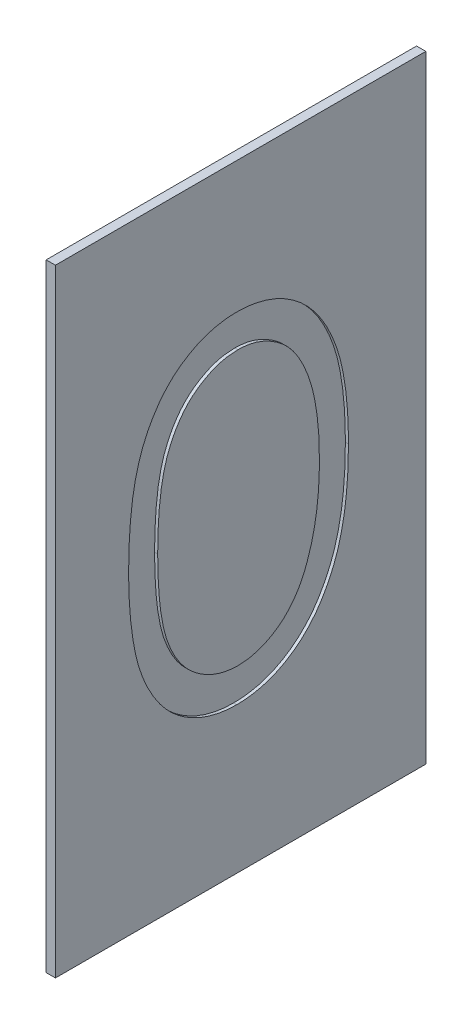
ISO-10303-21;
HEADER;
FILE_DESCRIPTION(('STEP AP214'),'2;1');
FILE_NAME('part.step','',(''),(''),'','','');
FILE_SCHEMA(('AUTOMOTIVE_DESIGN { 1 0 10303 214 1 1 1 1 }'));
ENDSEC;
DATA;
#1=APPLICATION_CONTEXT('core data for automotive mechanical design processes');
#2=APPLICATION_PROTOCOL_DEFINITION('international standard','automotive_design',2000,#1);
#3=PRODUCT_CONTEXT('',#1,'mechanical');
#4=PRODUCT('Part','Part','',(#3));
#5=PRODUCT_RELATED_PRODUCT_CATEGORY('part','',(#4));
#6=PRODUCT_DEFINITION_FORMATION('','',#4);
#7=PRODUCT_DEFINITION_CONTEXT('part definition',#1,'design');
#8=PRODUCT_DEFINITION('design','',#6,#7);
#9=PRODUCT_DEFINITION_SHAPE('','',#8);
#10=(LENGTH_UNIT() NAMED_UNIT(*) SI_UNIT(.MILLI.,.METRE.));
#11=(NAMED_UNIT(*) PLANE_ANGLE_UNIT() SI_UNIT($,.RADIAN.));
#12=(NAMED_UNIT(*) SI_UNIT($,.STERADIAN.) SOLID_ANGLE_UNIT());
#13=UNCERTAINTY_MEASURE_WITH_UNIT(LENGTH_MEASURE(1.E-05),#10,'distance_accuracy_value','');
#14=(GEOMETRIC_REPRESENTATION_CONTEXT(3) GLOBAL_UNCERTAINTY_ASSIGNED_CONTEXT((#13)) GLOBAL_UNIT_ASSIGNED_CONTEXT((#10,
#11,#12)) REPRESENTATION_CONTEXT('',''));
#15=CARTESIAN_POINT('',(0.,0.,0.));
#16=DIRECTION('',(0.,0.,1.));
#17=DIRECTION('',(1.,0.,0.));
#18=AXIS2_PLACEMENT_3D('',#15,#16,#17);
#19=CARTESIAN_POINT('',(1.5,0.,0.));
#20=DIRECTION('',(-1.,0.,0.));
#21=DIRECTION('',(0.,0.,1.));
#22=AXIS2_PLACEMENT_3D('',#19,#20,#21);
#23=PLANE('',#22);
#24=DIRECTION('',(0.,-1.,0.));
#25=VECTOR('',#24,1.);
#26=CARTESIAN_POINT('',(1.5,0.,0.));
#27=LINE('',#26,#25);
#28=CARTESIAN_POINT('',(1.5,100.,0.));
#29=VERTEX_POINT('',#28);
#30=CARTESIAN_POINT('',(1.5,0.,0.));
#31=VERTEX_POINT('',#30);
#32=EDGE_CURVE('E241',#29,#31,#27,.T.);
#33=ORIENTED_EDGE('',*,*,#32,.T.);
#34=DIRECTION('',(0.,0.,-1.));
#35=VECTOR('',#34,1.);
#36=CARTESIAN_POINT('',(1.5,0.,0.));
#37=LINE('',#36,#35);
#38=CARTESIAN_POINT('',(1.5,0.,-60.));
#39=VERTEX_POINT('',#38);
#40=EDGE_CURVE('E244',#31,#39,#37,.T.);
#41=ORIENTED_EDGE('',*,*,#40,.T.);
#42=DIRECTION('',(0.,1.,0.));
#43=VECTOR('',#42,1.);
#44=CARTESIAN_POINT('',(1.5,0.,-60.));
#45=LINE('',#44,#43);
#46=CARTESIAN_POINT('',(1.5,100.,-60.));
#47=VERTEX_POINT('',#46);
#48=EDGE_CURVE('E247',#39,#47,#45,.T.);
#49=ORIENTED_EDGE('',*,*,#48,.T.);
#50=DIRECTION('',(0.,0.,1.));
#51=VECTOR('',#50,1.);
#52=CARTESIAN_POINT('',(1.5,100.,0.));
#53=LINE('',#52,#51);
#54=EDGE_CURVE('E249',#47,#29,#53,.T.);
#55=ORIENTED_EDGE('',*,*,#54,.T.);
#56=EDGE_LOOP('',(#33,#41,#49,#55));
#57=FACE_BOUND('',#56,.T.);
#58=CARTESIAN_POINT('',(1.5,23.6564127604167,-29.3806902567546));
#59=CARTESIAN_POINT('',(1.5,23.663394754845,-28.9674180061508));
#60=CARTESIAN_POINT('',(1.5,23.6771618850506,-28.1525257940678));
#61=CARTESIAN_POINT('',(1.5,23.8195957710237,-26.9450460178353));
#62=CARTESIAN_POINT('',(1.5,24.0485908780596,-25.7730481916972));
#63=CARTESIAN_POINT('',(1.5,24.3692274388904,-24.6307489744057));
#64=CARTESIAN_POINT('',(1.5,24.7617002568579,-23.5122878044551));
#65=CARTESIAN_POINT('',(1.5,25.2730287384224,-22.4329054101378));
#66=CARTESIAN_POINT('',(1.5,25.8619148447295,-21.3806003354636));
#67=CARTESIAN_POINT('',(1.5,26.5325650472475,-20.3581800879635));
#68=CARTESIAN_POINT('',(1.5,27.3009225284031,-19.3848569766369));
#69=CARTESIAN_POINT('',(1.5,28.1507634380558,-18.4551538754574));
#70=CARTESIAN_POINT('',(1.5,29.1032950205589,-17.5924266259608));
#71=CARTESIAN_POINT('',(1.5,30.1434768450992,-16.7894490909199));
#72=CARTESIAN_POINT('',(1.5,31.2617393033776,-16.0262955927717));
#73=CARTESIAN_POINT('',(1.5,32.4733504017829,-15.3242959976608));
#74=CARTESIAN_POINT('',(1.5,33.7735059186205,-14.6749735640233));
#75=CARTESIAN_POINT('',(1.5,35.1706057489914,-14.0814549812815));
#76=CARTESIAN_POINT('',(1.5,36.6850367036891,-13.5552302567973));
#77=CARTESIAN_POINT('',(1.5,38.3341241884818,-13.0904025787571));
#78=CARTESIAN_POINT('',(1.5,40.1324235034342,-12.723391305194));
#79=CARTESIAN_POINT('',(1.5,42.0654913397782,-12.4092470736723));
#80=CARTESIAN_POINT('',(1.5,44.1416343140189,-12.1558653540416));
#81=CARTESIAN_POINT('',(1.5,46.361979540878,-11.9828809202329));
#82=CARTESIAN_POINT('',(1.5,48.7251434074949,-11.8759654315244));
#83=CARTESIAN_POINT('',(1.5,50.3460935792006,-11.8664575378113));
#84=CARTESIAN_POINT('',(1.5,51.1789576212565,-11.861572265625));
#85=B_SPLINE_CURVE_WITH_KNOTS('',3,(#58,#59,#60,#61,#62,#63,#64,#65,#66,#67,#68,#69,#70,#71,#72,
#73,#74,#75,#76,#77,#78,#79,#80,#81,#82,#83,#84),.UNSPECIFIED.,.F.,.F.,(4,1,1,1,1,1,1,1,1,1,1,1,
1,1,1,1,1,1,1,1,1,1,1,1,4),(0.,0.0337871463469911,0.0666216577242939,0.0992848780959723,
0.131361165042651,0.163585187595343,0.196103926987068,0.228902254323817,0.262158055905007,
0.295991222258316,0.3302178457248,0.365059825891954,0.400950737340108,0.437620382076738,
0.475707529437092,0.515380691625048,0.556413541493164,0.599764829872731,0.646424155584087,
0.696431444517567,0.749781517801557,0.806573306975532,0.867435531565399,0.931886753250874,1.),.UNSPECIFIED.);
#86=CARTESIAN_POINT('',(1.5,23.6564127604167,-29.3806902567546));
#87=VERTEX_POINT('',#86);
#88=CARTESIAN_POINT('',(1.5,51.1789576212565,-11.861572265625));
#89=VERTEX_POINT('',#88);
#90=EDGE_CURVE('E48',#87,#89,#85,.T.);
#91=ORIENTED_EDGE('',*,*,#90,.T.);
#92=CARTESIAN_POINT('',(1.5,51.1789576212565,-11.861572265625));
#93=CARTESIAN_POINT('',(1.5,52.0188140895463,-11.8664831568873));
#94=CARTESIAN_POINT('',(1.5,53.6502473846798,-11.8760226339487));
#95=CARTESIAN_POINT('',(1.5,56.0274758812476,-11.9821462239901));
#96=CARTESIAN_POINT('',(1.5,58.2576200516602,-12.1584395917828));
#97=CARTESIAN_POINT('',(1.5,60.3407866437241,-12.4000386664797));
#98=CARTESIAN_POINT('',(1.5,62.2775134516507,-12.6940467367497));
#99=CARTESIAN_POINT('',(1.5,64.0626247744858,-13.0865292904076));
#100=CARTESIAN_POINT('',(1.5,65.7043826823654,-13.5328687034412));
#101=CARTESIAN_POINT('',(1.5,67.2081408341796,-14.0501672137864));
#102=CARTESIAN_POINT('',(1.5,68.5941587191996,-14.6338690244035));
#103=CARTESIAN_POINT('',(1.5,69.888065035723,-15.2691693437936));
#104=CARTESIAN_POINT('',(1.5,71.0879020152212,-15.9812809388782));
#105=CARTESIAN_POINT('',(1.5,72.2128199810299,-16.7295053265417));
#106=CARTESIAN_POINT('',(1.5,73.2444048033848,-17.544130252147));
#107=CARTESIAN_POINT('',(1.5,74.1972246036325,-18.4019734021181));
#108=CARTESIAN_POINT('',(1.5,75.0492582512362,-19.3365163222641));
#109=CARTESIAN_POINT('',(1.5,75.8254700174827,-20.3159903921393));
#110=CARTESIAN_POINT('',(1.5,76.5059122681069,-21.3492635333498));
#111=CARTESIAN_POINT('',(1.5,77.1052584378265,-22.4068831925515));
#112=CARTESIAN_POINT('',(1.5,77.6172783533888,-23.496129033083));
#113=CARTESIAN_POINT('',(1.5,78.0198658428233,-24.6199749339887));
#114=CARTESIAN_POINT('',(1.5,78.3523933290681,-25.7683196605416));
#115=CARTESIAN_POINT('',(1.5,78.5797931500351,-26.9451775514423));
#116=CARTESIAN_POINT('',(1.5,78.7228734561928,-28.1524917214795));
#117=CARTESIAN_POINT('',(1.5,78.7365523420103,-28.9674065408661));
#118=CARTESIAN_POINT('',(1.5,78.7434895833333,-29.3806902567546));
#119=B_SPLINE_CURVE_WITH_KNOTS('',3,(#92,#93,#94,#95,#96,#97,#98,#99,#100,#101,#102,#103,#104,
#105,#106,#107,#108,#109,#110,#111,#112,#113,#114,#115,#116,#117,#118),.UNSPECIFIED.,.F.,.F.,(4,
1,1,1,1,1,1,1,1,1,1,1,1,1,1,1,1,1,1,1,1,1,1,1,4),(0.,0.0685946222587424,0.133246042443301,
0.194312586468256,0.251279223116966,0.304513439256347,0.354234906653325,0.400480588773989,
0.443410754938492,0.484014868616345,0.523252300773203,0.56104237272836,0.5979002393644,
0.633518488856195,0.668314351169651,0.702495671286382,0.736685353513458,0.770293169360789,
0.803437255019249,0.835912951666029,0.868460245789291,0.900846538243182,0.933466524630708,
0.966257575298123,1.),.UNSPECIFIED.);
#120=CARTESIAN_POINT('',(1.5,78.7434895833333,-29.3806902567546));
#121=VERTEX_POINT('',#120);
#122=EDGE_CURVE('E205',#89,#121,#119,.T.);
#123=ORIENTED_EDGE('',*,*,#122,.T.);
#124=CARTESIAN_POINT('',(1.5,78.7434895833333,-29.3806902567546));
#125=CARTESIAN_POINT('',(1.5,78.7361863068857,-29.7974263579749));
#126=CARTESIAN_POINT('',(1.5,78.7216623878437,-30.6261833466245));
#127=CARTESIAN_POINT('',(1.5,78.5820699083375,-31.851448395385));
#128=CARTESIAN_POINT('',(1.5,78.3504455256439,-33.0484071137447));
#129=CARTESIAN_POINT('',(1.5,78.0222578320978,-34.2119565075734));
#130=CARTESIAN_POINT('',(1.5,77.6151004603476,-35.3516541809536));
#131=CARTESIAN_POINT('',(1.5,77.1047685724331,-36.4585857638906));
#132=CARTESIAN_POINT('',(1.5,76.5107203513015,-37.5396269143394));
#133=CARTESIAN_POINT('',(1.5,75.8126956033717,-38.5775984273413));
#134=CARTESIAN_POINT('',(1.5,75.03444811871,-39.5838953645434));
#135=CARTESIAN_POINT('',(1.5,74.1546886596377,-40.5338002398714));
#136=CARTESIAN_POINT('',(1.5,73.1823003890858,-41.4273995176456));
#137=CARTESIAN_POINT('',(1.5,72.1276870209229,-42.2759082226572));
#138=CARTESIAN_POINT('',(1.5,70.970621050092,-43.0552534254247));
#139=CARTESIAN_POINT('',(1.5,69.7312269729847,-43.7974371419907));
#140=CARTESIAN_POINT('',(1.5,68.3878302437231,-44.4617486700023));
#141=CARTESIAN_POINT('',(1.5,66.9628453237507,-45.1015466145881));
#142=CARTESIAN_POINT('',(1.5,65.4168437131428,-45.6537964725571));
#143=CARTESIAN_POINT('',(1.5,63.7585401033495,-46.1518387593035));
#144=CARTESIAN_POINT('',(1.5,61.9683470422213,-46.5542545674256));
#145=CARTESIAN_POINT('',(1.5,60.0556571058591,-46.8894533343016));
#146=CARTESIAN_POINT('',(1.5,58.013446019933,-47.1491307210766));
#147=CARTESIAN_POINT('',(1.5,55.8460915069386,-47.3382590671508));
#148=CARTESIAN_POINT('',(1.5,53.5521676478965,-47.4381644970073));
#149=CARTESIAN_POINT('',(1.5,51.9837959145752,-47.4569790742944));
#150=CARTESIAN_POINT('',(1.5,51.1789576212565,-47.4666341145833));
#151=B_SPLINE_CURVE_WITH_KNOTS('',3,(#124,#125,#126,#127,#128,#129,#130,#131,#132,#133,#134,
#135,#136,#137,#138,#139,#140,#141,#142,#143,#144,#145,#146,#147,#148,#149,#150),.UNSPECIFIED.,
.F.,.F.,(4,1,1,1,1,1,1,1,1,1,1,1,1,1,1,1,1,1,1,1,1,1,1,1,4),(0.,0.0337881161627103,
0.0671939323738802,0.0998624108568251,0.132566612126258,0.165151173254786,0.197913187355792,
0.231319003566962,0.265083278267373,0.299255308758115,0.334398566504979,0.369942823509308,
0.406283560700061,0.444063819698508,0.482997706872775,0.523354446613304,0.565536589604149,
0.609612924065819,0.656390811376417,0.705885494936457,0.758324500261731,0.81383178294115,
0.87279455903939,0.934722229540074,1.),.UNSPECIFIED.);
#152=CARTESIAN_POINT('',(1.5,51.1789576212565,-47.4666341145833));
#153=VERTEX_POINT('',#152);
#154=EDGE_CURVE('E213',#121,#153,#151,.T.);
#155=ORIENTED_EDGE('',*,*,#154,.T.);
#156=CARTESIAN_POINT('',(1.5,51.1789576212565,-47.4666341145833));
#157=CARTESIAN_POINT('',(1.5,50.3776297500682,-47.4568789813061));
#158=CARTESIAN_POINT('',(1.5,48.8162750720924,-47.4378715019406));
#159=CARTESIAN_POINT('',(1.5,46.5326727260485,-47.339379047033));
#160=CARTESIAN_POINT('',(1.5,44.3768203241811,-47.1453701875261));
#161=CARTESIAN_POINT('',(1.5,42.3435474755822,-46.9026839577052));
#162=CARTESIAN_POINT('',(1.5,40.4413169559032,-46.5665615956107));
#163=CARTESIAN_POINT('',(1.5,38.6635462405944,-46.1532735911107));
#164=CARTESIAN_POINT('',(1.5,37.0025580917697,-45.6943953274922));
#165=CARTESIAN_POINT('',(1.5,35.4719597647716,-45.1279554656208));
#166=CARTESIAN_POINT('',(1.5,34.0503994774899,-44.507979128998));
#167=CARTESIAN_POINT('',(1.5,32.7229280736113,-43.8334397348069));
#168=CARTESIAN_POINT('',(1.5,31.4778121836957,-43.1107728282243));
#169=CARTESIAN_POINT('',(1.5,30.3250181209282,-42.3234456560703));
#170=CARTESIAN_POINT('',(1.5,29.2563796466292,-41.4842475482055));
#171=CARTESIAN_POINT('',(1.5,28.2907598956737,-40.5752172044109));
#172=CARTESIAN_POINT('',(1.5,27.4048920578214,-39.6219793639785));
#173=CARTESIAN_POINT('',(1.5,26.6166234471767,-38.6127210764199));
#174=CARTESIAN_POINT('',(1.5,25.9266693721836,-37.5585615311522));
#175=CARTESIAN_POINT('',(1.5,25.3096403048888,-36.481233358692));
#176=CARTESIAN_POINT('',(1.5,24.8121003119655,-35.3616213631684));
#177=CARTESIAN_POINT('',(1.5,24.3848907803628,-34.2250981318393));
#178=CARTESIAN_POINT('',(1.5,24.0585074803961,-33.0554070590677));
#179=CARTESIAN_POINT('',(1.5,23.8328307497609,-31.8540061917634));
#180=CARTESIAN_POINT('',(1.5,23.6745553707257,-30.6270065462992));
#181=CARTESIAN_POINT('',(1.5,23.6624812373806,-29.7975675177424));
#182=CARTESIAN_POINT('',(1.5,23.6564127604167,-29.3806902567546));
#183=B_SPLINE_CURVE_WITH_KNOTS('',3,(#156,#157,#158,#159,#160,#161,#162,#163,#164,#165,#166,
#167,#168,#169,#170,#171,#172,#173,#174,#175,#176,#177,#178,#179,#180,#181,#182),.UNSPECIFIED.,
.F.,.F.,(4,1,1,1,1,1,1,1,1,1,1,1,1,1,1,1,1,1,1,1,1,1,1,1,4),(0.,0.0650632896172793,
0.126773166466523,0.185515763226079,0.240764679167715,0.292979796023598,0.342250372779768,
0.38891928618566,0.43277566405831,0.474628432631118,0.514774690637954,0.553605893498443,
0.591426406431173,0.628028119946068,0.663803634110321,0.698984336131664,0.733591489306705,
0.76762846915114,0.801208347786592,0.834263839726623,0.866980694728776,0.899719741518161,
0.932701912498538,0.96617588343275,1.),.UNSPECIFIED.);
#184=EDGE_CURVE('E221',#153,#87,#183,.T.);
#185=ORIENTED_EDGE('',*,*,#184,.T.);
#186=EDGE_LOOP('',(#91,#123,#155,#185));
#187=FACE_BOUND('',#186,.T.);
#188=ADVANCED_FACE('F33',(#57,#187),#23,.F.);
#189=CARTESIAN_POINT('',(1.5,0.,0.));
#190=DIRECTION('',(0.,0.,-1.));
#191=DIRECTION('',(-1.,0.,0.));
#192=AXIS2_PLACEMENT_3D('',#189,#190,#191);
#193=PLANE('',#192);
#194=DIRECTION('',(0.,-1.,0.));
#195=VECTOR('',#194,1.);
#196=CARTESIAN_POINT('',(0.,0.,0.));
#197=LINE('',#196,#195);
#198=CARTESIAN_POINT('',(0.,100.,0.));
#199=VERTEX_POINT('',#198);
#200=CARTESIAN_POINT('',(0.,0.,0.));
#201=VERTEX_POINT('',#200);
#202=EDGE_CURVE('E240',#199,#201,#197,.T.);
#203=ORIENTED_EDGE('',*,*,#202,.T.);
#204=DIRECTION('',(-1.,0.,0.));
#205=VECTOR('',#204,1.);
#206=CARTESIAN_POINT('',(1.5,0.,0.));
#207=LINE('',#206,#205);
#208=EDGE_CURVE('E11',#31,#201,#207,.T.);
#209=ORIENTED_EDGE('',*,*,#208,.F.);
#210=ORIENTED_EDGE('',*,*,#32,.F.);
#211=DIRECTION('',(-1.,0.,0.));
#212=VECTOR('',#211,1.);
#213=CARTESIAN_POINT('',(1.5,100.,0.));
#214=LINE('',#213,#212);
#215=EDGE_CURVE('E251',#29,#199,#214,.T.);
#216=ORIENTED_EDGE('',*,*,#215,.T.);
#217=EDGE_LOOP('',(#203,#209,#210,#216));
#218=FACE_BOUND('',#217,.T.);
#219=ADVANCED_FACE('F35',(#218),#193,.F.);
#220=CARTESIAN_POINT('',(1.5,0.,0.));
#221=DIRECTION('',(0.,1.,0.));
#222=DIRECTION('',(0.,0.,1.));
#223=AXIS2_PLACEMENT_3D('',#220,#221,#222);
#224=PLANE('',#223);
#225=DIRECTION('',(0.,0.,-1.));
#226=VECTOR('',#225,1.);
#227=CARTESIAN_POINT('',(0.,0.,0.));
#228=LINE('',#227,#226);
#229=CARTESIAN_POINT('',(0.,0.,-60.));
#230=VERTEX_POINT('',#229);
#231=EDGE_CURVE('E254',#201,#230,#228,.T.);
#232=ORIENTED_EDGE('',*,*,#231,.T.);
#233=DIRECTION('',(-1.,0.,0.));
#234=VECTOR('',#233,1.);
#235=CARTESIAN_POINT('',(1.5,0.,-60.));
#236=LINE('',#235,#234);
#237=EDGE_CURVE('E41',#39,#230,#236,.T.);
#238=ORIENTED_EDGE('',*,*,#237,.F.);
#239=ORIENTED_EDGE('',*,*,#40,.F.);
#240=ORIENTED_EDGE('',*,*,#208,.T.);
#241=EDGE_LOOP('',(#232,#238,#239,#240));
#242=FACE_BOUND('',#241,.T.);
#243=ADVANCED_FACE('F284',(#242),#224,.F.);
#244=CARTESIAN_POINT('',(1.5,0.,-60.));
#245=DIRECTION('',(0.,0.,1.));
#246=DIRECTION('',(1.,0.,0.));
#247=AXIS2_PLACEMENT_3D('',#244,#245,#246);
#248=PLANE('',#247);
#249=DIRECTION('',(0.,1.,0.));
#250=VECTOR('',#249,1.);
#251=CARTESIAN_POINT('',(0.,0.,-60.));
#252=LINE('',#251,#250);
#253=CARTESIAN_POINT('',(0.,100.,-60.));
#254=VERTEX_POINT('',#253);
#255=EDGE_CURVE('E256',#230,#254,#252,.T.);
#256=ORIENTED_EDGE('',*,*,#255,.T.);
#257=DIRECTION('',(-1.,0.,0.));
#258=VECTOR('',#257,1.);
#259=CARTESIAN_POINT('',(1.5,100.,-60.));
#260=LINE('',#259,#258);
#261=EDGE_CURVE('E261',#47,#254,#260,.T.);
#262=ORIENTED_EDGE('',*,*,#261,.F.);
#263=ORIENTED_EDGE('',*,*,#48,.F.);
#264=ORIENTED_EDGE('',*,*,#237,.T.);
#265=EDGE_LOOP('',(#256,#262,#263,#264));
#266=FACE_BOUND('',#265,.T.);
#267=ADVANCED_FACE('F268',(#266),#248,.F.);
#268=CARTESIAN_POINT('',(1.5,100.,0.));
#269=DIRECTION('',(0.,-1.,0.));
#270=DIRECTION('',(0.,0.,-1.));
#271=AXIS2_PLACEMENT_3D('',#268,#269,#270);
#272=PLANE('',#271);
#273=DIRECTION('',(0.,0.,1.));
#274=VECTOR('',#273,1.);
#275=CARTESIAN_POINT('',(0.,100.,0.));
#276=LINE('',#275,#274);
#277=EDGE_CURVE('E245',#254,#199,#276,.T.);
#278=ORIENTED_EDGE('',*,*,#277,.T.);
#279=ORIENTED_EDGE('',*,*,#215,.F.);
#280=ORIENTED_EDGE('',*,*,#54,.F.);
#281=ORIENTED_EDGE('',*,*,#261,.T.);
#282=EDGE_LOOP('',(#278,#279,#280,#281));
#283=FACE_BOUND('',#282,.T.);
#284=ADVANCED_FACE('F277',(#283),#272,.F.);
#285=CARTESIAN_POINT('',(0.,0.,0.));
#286=DIRECTION('',(-1.,0.,0.));
#287=DIRECTION('',(0.,0.,1.));
#288=AXIS2_PLACEMENT_3D('',#285,#286,#287);
#289=PLANE('',#288);
#290=ORIENTED_EDGE('',*,*,#202,.F.);
#291=ORIENTED_EDGE('',*,*,#277,.F.);
#292=ORIENTED_EDGE('',*,*,#255,.F.);
#293=ORIENTED_EDGE('',*,*,#231,.F.);
#294=EDGE_LOOP('',(#290,#291,#292,#293));
#295=FACE_BOUND('',#294,.T.);
#296=ADVANCED_FACE('F274',(#295),#289,.T.);
#297=CARTESIAN_POINT('',(1.,23.6564127604167,-29.3806902567546));
#298=CARTESIAN_POINT('',(1.,23.663394754845,-28.9674180061508));
#299=CARTESIAN_POINT('',(1.,23.6771618850506,-28.1525257940678));
#300=CARTESIAN_POINT('',(1.,23.8195957710237,-26.9450460178353));
#301=CARTESIAN_POINT('',(1.,24.0485908780596,-25.7730481916972));
#302=CARTESIAN_POINT('',(1.,24.3692274388904,-24.6307489744057));
#303=CARTESIAN_POINT('',(1.,24.7617002568579,-23.5122878044551));
#304=CARTESIAN_POINT('',(1.,25.2730287384224,-22.4329054101378));
#305=CARTESIAN_POINT('',(1.,25.8619148447295,-21.3806003354636));
#306=CARTESIAN_POINT('',(1.,26.5325650472475,-20.3581800879635));
#307=CARTESIAN_POINT('',(1.,27.3009225284031,-19.3848569766369));
#308=CARTESIAN_POINT('',(1.,28.1507634380558,-18.4551538754574));
#309=CARTESIAN_POINT('',(1.,29.1032950205589,-17.5924266259608));
#310=CARTESIAN_POINT('',(1.,30.1434768450992,-16.7894490909199));
#311=CARTESIAN_POINT('',(1.,31.2617393033776,-16.0262955927717));
#312=CARTESIAN_POINT('',(1.,32.4733504017829,-15.3242959976608));
#313=CARTESIAN_POINT('',(1.,33.7735059186205,-14.6749735640233));
#314=CARTESIAN_POINT('',(1.,35.1706057489914,-14.0814549812815));
#315=CARTESIAN_POINT('',(1.,36.6850367036891,-13.5552302567973));
#316=CARTESIAN_POINT('',(1.,38.3341241884818,-13.0904025787571));
#317=CARTESIAN_POINT('',(1.,40.1324235034342,-12.723391305194));
#318=CARTESIAN_POINT('',(1.,42.0654913397782,-12.4092470736723));
#319=CARTESIAN_POINT('',(1.,44.1416343140189,-12.1558653540416));
#320=CARTESIAN_POINT('',(1.,46.361979540878,-11.9828809202329));
#321=CARTESIAN_POINT('',(1.,48.7251434074949,-11.8759654315244));
#322=CARTESIAN_POINT('',(1.,50.3460935792006,-11.8664575378113));
#323=CARTESIAN_POINT('',(1.,51.1789576212565,-11.861572265625));
#324=B_SPLINE_CURVE_WITH_KNOTS('',3,(#297,#298,#299,#300,#301,#302,#303,#304,#305,#306,#307,
#308,#309,#310,#311,#312,#313,#314,#315,#316,#317,#318,#319,#320,#321,#322,#323),.UNSPECIFIED.,
.F.,.F.,(4,1,1,1,1,1,1,1,1,1,1,1,1,1,1,1,1,1,1,1,1,1,1,1,4),(0.,0.0337871463469911,
0.0666216577242939,0.0992848780959723,0.131361165042651,0.163585187595343,0.196103926987068,
0.228902254323817,0.262158055905007,0.295991222258316,0.3302178457248,0.365059825891954,
0.400950737340108,0.437620382076738,0.475707529437092,0.515380691625048,0.556413541493164,
0.599764829872731,0.646424155584087,0.696431444517567,0.749781517801557,0.806573306975532,
0.867435531565399,0.931886753250874,1.),.UNSPECIFIED.);
#325=DIRECTION('',(1.,0.,0.));
#326=VECTOR('',#325,1.);
#327=SURFACE_OF_LINEAR_EXTRUSION('',#324,#326);
#328=ORIENTED_EDGE('',*,*,#90,.F.);
#329=DIRECTION('',(1.,0.,0.));
#330=VECTOR('',#329,1.);
#331=CARTESIAN_POINT('',(1.,23.6564127604167,-29.3806902567546));
#332=LINE('',#331,#330);
#333=CARTESIAN_POINT('',(1.,23.6564127604167,-29.3806902567546));
#334=VERTEX_POINT('',#333);
#335=EDGE_CURVE('E193',#334,#87,#332,.T.);
#336=ORIENTED_EDGE('',*,*,#335,.F.);
#337=CARTESIAN_POINT('',(1.,51.1789576212565,-11.861572265625));
#338=VERTEX_POINT('',#337);
#339=EDGE_CURVE('E229',#334,#338,#324,.T.);
#340=ORIENTED_EDGE('',*,*,#339,.T.);
#341=DIRECTION('',(1.,0.,0.));
#342=VECTOR('',#341,1.);
#343=CARTESIAN_POINT('',(1.,51.1789576212565,-11.861572265625));
#344=LINE('',#343,#342);
#345=EDGE_CURVE('E238',#338,#89,#344,.T.);
#346=ORIENTED_EDGE('',*,*,#345,.T.);
#347=EDGE_LOOP('',(#328,#336,#340,#346));
#348=FACE_BOUND('',#347,.T.);
#349=ADVANCED_FACE('F362',(#348),#327,.T.);
#350=CARTESIAN_POINT('',(1.,51.1789576212565,-11.861572265625));
#351=CARTESIAN_POINT('',(1.,52.0188140895463,-11.8664831568873));
#352=CARTESIAN_POINT('',(1.,53.6502473846798,-11.8760226339487));
#353=CARTESIAN_POINT('',(1.,56.0274758812476,-11.9821462239901));
#354=CARTESIAN_POINT('',(1.,58.2576200516602,-12.1584395917828));
#355=CARTESIAN_POINT('',(1.,60.3407866437241,-12.4000386664797));
#356=CARTESIAN_POINT('',(1.,62.2775134516507,-12.6940467367497));
#357=CARTESIAN_POINT('',(1.,64.0626247744858,-13.0865292904076));
#358=CARTESIAN_POINT('',(1.,65.7043826823654,-13.5328687034412));
#359=CARTESIAN_POINT('',(1.,67.2081408341796,-14.0501672137864));
#360=CARTESIAN_POINT('',(1.,68.5941587191996,-14.6338690244035));
#361=CARTESIAN_POINT('',(1.,69.888065035723,-15.2691693437936));
#362=CARTESIAN_POINT('',(1.,71.0879020152212,-15.9812809388782));
#363=CARTESIAN_POINT('',(1.,72.2128199810299,-16.7295053265417));
#364=CARTESIAN_POINT('',(1.,73.2444048033848,-17.544130252147));
#365=CARTESIAN_POINT('',(1.,74.1972246036325,-18.4019734021181));
#366=CARTESIAN_POINT('',(1.,75.0492582512362,-19.3365163222641));
#367=CARTESIAN_POINT('',(1.,75.8254700174827,-20.3159903921393));
#368=CARTESIAN_POINT('',(1.,76.5059122681069,-21.3492635333498));
#369=CARTESIAN_POINT('',(1.,77.1052584378265,-22.4068831925515));
#370=CARTESIAN_POINT('',(1.,77.6172783533888,-23.496129033083));
#371=CARTESIAN_POINT('',(1.,78.0198658428233,-24.6199749339887));
#372=CARTESIAN_POINT('',(1.,78.3523933290681,-25.7683196605416));
#373=CARTESIAN_POINT('',(1.,78.5797931500351,-26.9451775514423));
#374=CARTESIAN_POINT('',(1.,78.7228734561928,-28.1524917214795));
#375=CARTESIAN_POINT('',(1.,78.7365523420103,-28.9674065408661));
#376=CARTESIAN_POINT('',(1.,78.7434895833333,-29.3806902567546));
#377=B_SPLINE_CURVE_WITH_KNOTS('',3,(#350,#351,#352,#353,#354,#355,#356,#357,#358,#359,#360,
#361,#362,#363,#364,#365,#366,#367,#368,#369,#370,#371,#372,#373,#374,#375,#376),.UNSPECIFIED.,
.F.,.F.,(4,1,1,1,1,1,1,1,1,1,1,1,1,1,1,1,1,1,1,1,1,1,1,1,4),(0.,0.0685946222587424,
0.133246042443301,0.194312586468256,0.251279223116966,0.304513439256347,0.354234906653325,
0.400480588773989,0.443410754938492,0.484014868616345,0.523252300773203,0.56104237272836,
0.5979002393644,0.633518488856195,0.668314351169651,0.702495671286382,0.736685353513458,
0.770293169360789,0.803437255019249,0.835912951666029,0.868460245789291,0.900846538243182,
0.933466524630708,0.966257575298123,1.),.UNSPECIFIED.);
#378=DIRECTION('',(1.,0.,0.));
#379=VECTOR('',#378,1.);
#380=SURFACE_OF_LINEAR_EXTRUSION('',#377,#379);
#381=ORIENTED_EDGE('',*,*,#122,.F.);
#382=ORIENTED_EDGE('',*,*,#345,.F.);
#383=CARTESIAN_POINT('',(1.,78.7434895833333,-29.3806902567546));
#384=VERTEX_POINT('',#383);
#385=EDGE_CURVE('E355',#338,#384,#377,.T.);
#386=ORIENTED_EDGE('',*,*,#385,.T.);
#387=DIRECTION('',(1.,0.,0.));
#388=VECTOR('',#387,1.);
#389=CARTESIAN_POINT('',(1.,78.7434895833333,-29.3806902567546));
#390=LINE('',#389,#388);
#391=EDGE_CURVE('E236',#384,#121,#390,.T.);
#392=ORIENTED_EDGE('',*,*,#391,.T.);
#393=EDGE_LOOP('',(#381,#382,#386,#392));
#394=FACE_BOUND('',#393,.T.);
#395=ADVANCED_FACE('F364',(#394),#380,.T.);
#396=CARTESIAN_POINT('',(1.,78.7434895833333,-29.3806902567546));
#397=CARTESIAN_POINT('',(1.,78.7361863068857,-29.7974263579749));
#398=CARTESIAN_POINT('',(1.,78.7216623878437,-30.6261833466245));
#399=CARTESIAN_POINT('',(1.,78.5820699083375,-31.851448395385));
#400=CARTESIAN_POINT('',(1.,78.3504455256439,-33.0484071137447));
#401=CARTESIAN_POINT('',(1.,78.0222578320978,-34.2119565075734));
#402=CARTESIAN_POINT('',(1.,77.6151004603476,-35.3516541809536));
#403=CARTESIAN_POINT('',(1.,77.1047685724331,-36.4585857638906));
#404=CARTESIAN_POINT('',(1.,76.5107203513015,-37.5396269143394));
#405=CARTESIAN_POINT('',(1.,75.8126956033717,-38.5775984273413));
#406=CARTESIAN_POINT('',(1.,75.03444811871,-39.5838953645434));
#407=CARTESIAN_POINT('',(1.,74.1546886596377,-40.5338002398714));
#408=CARTESIAN_POINT('',(1.,73.1823003890858,-41.4273995176456));
#409=CARTESIAN_POINT('',(1.,72.1276870209229,-42.2759082226572));
#410=CARTESIAN_POINT('',(1.,70.970621050092,-43.0552534254247));
#411=CARTESIAN_POINT('',(1.,69.7312269729847,-43.7974371419907));
#412=CARTESIAN_POINT('',(1.,68.3878302437231,-44.4617486700023));
#413=CARTESIAN_POINT('',(1.,66.9628453237507,-45.1015466145881));
#414=CARTESIAN_POINT('',(1.,65.4168437131428,-45.6537964725571));
#415=CARTESIAN_POINT('',(1.,63.7585401033495,-46.1518387593035));
#416=CARTESIAN_POINT('',(1.,61.9683470422213,-46.5542545674256));
#417=CARTESIAN_POINT('',(1.,60.0556571058591,-46.8894533343016));
#418=CARTESIAN_POINT('',(1.,58.013446019933,-47.1491307210766));
#419=CARTESIAN_POINT('',(1.,55.8460915069386,-47.3382590671508));
#420=CARTESIAN_POINT('',(1.,53.5521676478965,-47.4381644970073));
#421=CARTESIAN_POINT('',(1.,51.9837959145752,-47.4569790742944));
#422=CARTESIAN_POINT('',(1.,51.1789576212565,-47.4666341145833));
#423=B_SPLINE_CURVE_WITH_KNOTS('',3,(#396,#397,#398,#399,#400,#401,#402,#403,#404,#405,#406,
#407,#408,#409,#410,#411,#412,#413,#414,#415,#416,#417,#418,#419,#420,#421,#422),.UNSPECIFIED.,
.F.,.F.,(4,1,1,1,1,1,1,1,1,1,1,1,1,1,1,1,1,1,1,1,1,1,1,1,4),(0.,0.0337881161627103,
0.0671939323738802,0.0998624108568251,0.132566612126258,0.165151173254786,0.197913187355792,
0.231319003566962,0.265083278267373,0.299255308758115,0.334398566504979,0.369942823509308,
0.406283560700061,0.444063819698508,0.482997706872775,0.523354446613304,0.565536589604149,
0.609612924065819,0.656390811376417,0.705885494936457,0.758324500261731,0.81383178294115,
0.87279455903939,0.934722229540074,1.),.UNSPECIFIED.);
#424=DIRECTION('',(1.,0.,0.));
#425=VECTOR('',#424,1.);
#426=SURFACE_OF_LINEAR_EXTRUSION('',#423,#425);
#427=ORIENTED_EDGE('',*,*,#154,.F.);
#428=ORIENTED_EDGE('',*,*,#391,.F.);
#429=CARTESIAN_POINT('',(1.,51.1789576212565,-47.4666341145833));
#430=VERTEX_POINT('',#429);
#431=EDGE_CURVE('E194',#384,#430,#423,.T.);
#432=ORIENTED_EDGE('',*,*,#431,.T.);
#433=DIRECTION('',(1.,0.,0.));
#434=VECTOR('',#433,1.);
#435=CARTESIAN_POINT('',(1.,51.1789576212565,-47.4666341145833));
#436=LINE('',#435,#434);
#437=EDGE_CURVE('E234',#430,#153,#436,.T.);
#438=ORIENTED_EDGE('',*,*,#437,.T.);
#439=EDGE_LOOP('',(#427,#428,#432,#438));
#440=FACE_BOUND('',#439,.T.);
#441=ADVANCED_FACE('F184',(#440),#426,.T.);
#442=CARTESIAN_POINT('',(1.,51.1789576212565,-47.4666341145833));
#443=CARTESIAN_POINT('',(1.,50.3776297500682,-47.4568789813061));
#444=CARTESIAN_POINT('',(1.,48.8162750720924,-47.4378715019406));
#445=CARTESIAN_POINT('',(1.,46.5326727260485,-47.339379047033));
#446=CARTESIAN_POINT('',(1.,44.3768203241811,-47.1453701875261));
#447=CARTESIAN_POINT('',(1.,42.3435474755822,-46.9026839577052));
#448=CARTESIAN_POINT('',(0.999999999999999,40.4413169559032,-46.5665615956107));
#449=CARTESIAN_POINT('',(1.,38.6635462405944,-46.1532735911107));
#450=CARTESIAN_POINT('',(1.,37.0025580917697,-45.6943953274922));
#451=CARTESIAN_POINT('',(1.,35.4719597647716,-45.1279554656208));
#452=CARTESIAN_POINT('',(1.,34.0503994774899,-44.507979128998));
#453=CARTESIAN_POINT('',(1.,32.7229280736113,-43.8334397348069));
#454=CARTESIAN_POINT('',(1.,31.4778121836957,-43.1107728282243));
#455=CARTESIAN_POINT('',(1.,30.3250181209282,-42.3234456560703));
#456=CARTESIAN_POINT('',(1.,29.2563796466292,-41.4842475482055));
#457=CARTESIAN_POINT('',(1.,28.2907598956737,-40.5752172044109));
#458=CARTESIAN_POINT('',(0.999999999999999,27.4048920578214,-39.6219793639785));
#459=CARTESIAN_POINT('',(1.,26.6166234471767,-38.6127210764199));
#460=CARTESIAN_POINT('',(1.,25.9266693721836,-37.5585615311522));
#461=CARTESIAN_POINT('',(1.,25.3096403048888,-36.481233358692));
#462=CARTESIAN_POINT('',(1.,24.8121003119655,-35.3616213631684));
#463=CARTESIAN_POINT('',(1.,24.3848907803628,-34.2250981318393));
#464=CARTESIAN_POINT('',(1.,24.0585074803961,-33.0554070590677));
#465=CARTESIAN_POINT('',(1.,23.8328307497609,-31.8540061917634));
#466=CARTESIAN_POINT('',(1.,23.6745553707257,-30.6270065462992));
#467=CARTESIAN_POINT('',(1.,23.6624812373806,-29.7975675177424));
#468=CARTESIAN_POINT('',(1.,23.6564127604167,-29.3806902567546));
#469=B_SPLINE_CURVE_WITH_KNOTS('',3,(#442,#443,#444,#445,#446,#447,#448,#449,#450,#451,#452,
#453,#454,#455,#456,#457,#458,#459,#460,#461,#462,#463,#464,#465,#466,#467,#468),.UNSPECIFIED.,
.F.,.F.,(4,1,1,1,1,1,1,1,1,1,1,1,1,1,1,1,1,1,1,1,1,1,1,1,4),(0.,0.0650632896172793,
0.126773166466523,0.185515763226079,0.240764679167715,0.292979796023598,0.342250372779768,
0.38891928618566,0.43277566405831,0.474628432631118,0.514774690637954,0.553605893498443,
0.591426406431173,0.628028119946068,0.663803634110321,0.698984336131664,0.733591489306705,
0.76762846915114,0.801208347786592,0.834263839726623,0.866980694728776,0.899719741518161,
0.932701912498538,0.96617588343275,1.),.UNSPECIFIED.);
#470=DIRECTION('',(1.,0.,0.));
#471=VECTOR('',#470,1.);
#472=SURFACE_OF_LINEAR_EXTRUSION('',#469,#471);
#473=ORIENTED_EDGE('',*,*,#184,.F.);
#474=ORIENTED_EDGE('',*,*,#437,.F.);
#475=EDGE_CURVE('E188',#430,#334,#469,.T.);
#476=ORIENTED_EDGE('',*,*,#475,.T.);
#477=ORIENTED_EDGE('',*,*,#335,.T.);
#478=EDGE_LOOP('',(#473,#474,#476,#477));
#479=FACE_BOUND('',#478,.T.);
#480=ADVANCED_FACE('F180',(#479),#472,.T.);
#481=CARTESIAN_POINT('',(1.,33.2554532211066,-14.9384589948363));
#482=DIRECTION('',(1.,0.,0.));
#483=DIRECTION('',(0.,1.,0.));
#484=AXIS2_PLACEMENT_3D('',#481,#482,#483);
#485=PLANE('',#484);
#486=CARTESIAN_POINT('',(1.,51.199951171875,-42.7640787760417));
#487=CARTESIAN_POINT('',(1.,51.8297616552419,-42.7558416725913));
#488=CARTESIAN_POINT('',(1.,53.0618055975448,-42.7397281373672));
#489=CARTESIAN_POINT('',(1.,54.8661315682139,-42.6781359791436));
#490=CARTESIAN_POINT('',(1.,56.5798742805417,-42.5190861888801));
#491=CARTESIAN_POINT('',(1.,58.2104166039194,-42.3424368528109));
#492=CARTESIAN_POINT('',(1.,59.7487325546354,-42.0819760853028));
#493=CARTESIAN_POINT('',(1.,61.2077001200067,-41.8011454428141));
#494=CARTESIAN_POINT('',(1.,62.5692445826864,-41.4238479962564));
#495=CARTESIAN_POINT('',(1.,63.8546827818188,-41.0208212591843));
#496=CARTESIAN_POINT('',(1.,65.04941035405,-40.559546482893));
#497=CARTESIAN_POINT('',(1.,66.1589975448192,-40.0517804363178));
#498=CARTESIAN_POINT('',(1.,67.1888012191044,-39.5094899728276));
#499=CARTESIAN_POINT('',(1.,68.1359959505892,-38.9204815276706));
#500=CARTESIAN_POINT('',(1.,69.0048244023901,-38.291747330105));
#501=CARTESIAN_POINT('',(1.,69.7778666059187,-37.6066927274074));
#502=CARTESIAN_POINT('',(1.,70.4790816216229,-36.8924914483621));
#503=CARTESIAN_POINT('',(1.,71.279491164771,-35.8921445877783));
#504=CARTESIAN_POINT('',(1.,72.0956075990309,-34.5825319468841));
#505=CARTESIAN_POINT('',(1.,72.8466592897971,-32.9529601493739));
#506=CARTESIAN_POINT('',(1.,73.277959781233,-31.2571399501815));
#507=CARTESIAN_POINT('',(1.,73.3387689252756,-30.1107280883112));
#508=CARTESIAN_POINT('',(1.,73.369140625,-29.5381418863932));
#509=B_SPLINE_CURVE_WITH_KNOTS('',3,(#486,#487,#488,#489,#490,#491,#492,#493,#494,#495,#496,
#497,#498,#499,#500,#501,#502,#503,#504,#505,#506,#507,#508),.UNSPECIFIED.,.F.,.F.,(4,1,1,1,1,1,
1,1,1,1,1,1,1,1,1,1,1,1,1,1,4),(0.,0.0656811979906387,0.128486464174065,0.188175130328008,
0.245106130669986,0.299448424529475,0.350822936009382,0.399941680533777,0.446671743632372,
0.491254533373498,0.533376344270436,0.573852754968224,0.612526311719453,0.649597136445329,
0.68553204155385,0.720105786068201,0.75383766297365,0.818925416046714,0.880493461650164,
0.940311333846057,1.),.UNSPECIFIED.);
#510=CARTESIAN_POINT('',(1.,51.199951171875,-42.7640787760417));
#511=VERTEX_POINT('',#510);
#512=CARTESIAN_POINT('',(1.,73.369140625,-29.5381418863932));
#513=VERTEX_POINT('',#512);
#514=EDGE_CURVE('E142',#511,#513,#509,.T.);
#515=ORIENTED_EDGE('',*,*,#514,.F.);
#516=CARTESIAN_POINT('',(1.,38.0264981587728,-40.7801882425944));
#517=CARTESIAN_POINT('',(1.,38.4940511011318,-40.9381629860079));
#518=CARTESIAN_POINT('',(1.,39.4433840879882,-41.258919463886));
#519=CARTESIAN_POINT('',(1.,40.9160257346146,-41.672306399693));
#520=CARTESIAN_POINT('',(1.,42.461115663744,-41.9978654838929));
#521=CARTESIAN_POINT('',(0.999999999999999,44.0694201281189,-42.2907564709743));
#522=CARTESIAN_POINT('',(1.,45.7527999431292,-42.4906704209778));
#523=CARTESIAN_POINT('',(1.,47.5060465377049,-42.6515802399637));
#524=CARTESIAN_POINT('',(1.,49.3304818178803,-42.7463594906454));
#525=CARTESIAN_POINT('',(1.,50.5700388045039,-42.7581083133603));
#526=CARTESIAN_POINT('',(1.,51.199951171875,-42.7640787760417));
#527=B_SPLINE_CURVE_WITH_KNOTS('',3,(#516,#517,#518,#519,#520,#521,#522,#523,#524,#525,#526),
.UNSPECIFIED.,.F.,.F.,(4,1,1,1,1,1,1,1,4),(0.,0.110588338595336,0.224541754053595,
0.342503494050104,0.464324098417358,0.590756032701766,0.722227475355514,0.858842836208724,1.),.UNSPECIFIED.);
#528=CARTESIAN_POINT('',(1.,38.0264981587728,-40.7801882425944));
#529=VERTEX_POINT('',#528);
#530=EDGE_CURVE('E484',#529,#511,#527,.T.);
#531=ORIENTED_EDGE('',*,*,#530,.F.);
#532=CARTESIAN_POINT('',(1.,29.03076171875,-29.5381418863932));
#533=CARTESIAN_POINT('',(1.,29.054682735462,-30.1183985177739));
#534=CARTESIAN_POINT('',(1.,29.1024753809143,-31.2777137671554));
#535=CARTESIAN_POINT('',(0.999999999999999,29.5635756182629,-32.9714851435386));
#536=CARTESIAN_POINT('',(1.,30.2592897125074,-34.6157981225952));
#537=CARTESIAN_POINT('',(1.,31.0819308319365,-35.904415626924));
#538=CARTESIAN_POINT('',(1.,31.8653592185246,-36.8847810225513));
#539=CARTESIAN_POINT('',(1.,32.5333029941524,-37.5871940796406));
#540=CARTESIAN_POINT('',(1.,33.2812122993963,-38.2318932603904));
#541=CARTESIAN_POINT('',(1.,34.0881602543501,-38.8433563272183));
#542=CARTESIAN_POINT('',(1.,34.969563803333,-39.4041711578615));
#543=CARTESIAN_POINT('',(1.,35.9211845852348,-39.9141440403617));
#544=CARTESIAN_POINT('',(1.,36.9456652252525,-40.379505290614));
#545=CARTESIAN_POINT('',(1.,37.6608451294399,-40.6446345130125));
#546=CARTESIAN_POINT('',(1.,38.0264981587728,-40.7801882425944));
#547=B_SPLINE_CURVE_WITH_KNOTS('',3,(#532,#533,#534,#535,#536,#537,#538,#539,#540,#541,#542,
#543,#544,#545,#546),.UNSPECIFIED.,.F.,.F.,(4,1,1,1,1,1,1,1,1,1,1,1,4),(0.,0.112813400744458,
0.225393883920729,0.339594814562701,0.459675410224864,0.521735190087933,0.583925838738916,
0.648174144765369,0.713881038113067,0.781004454907389,0.851450927556555,0.924050692664178,1.),.UNSPECIFIED.);
#548=CARTESIAN_POINT('',(1.,29.03076171875,-29.5381418863932));
#549=VERTEX_POINT('',#548);
#550=EDGE_CURVE('E153',#549,#529,#547,.T.);
#551=ORIENTED_EDGE('',*,*,#550,.F.);
#552=CARTESIAN_POINT('',(1.,51.199951171875,-16.5641276041667));
#553=CARTESIAN_POINT('',(1.,50.5000576712981,-16.5659158940733));
#554=CARTESIAN_POINT('',(1.,49.1417018178352,-16.5693866136332));
#555=CARTESIAN_POINT('',(1.,47.1678235321721,-16.6600564190105));
#556=CARTESIAN_POINT('',(1.,45.3267854689727,-16.7835739478921));
#557=CARTESIAN_POINT('',(1.,43.6162499966296,-16.9428890716957));
#558=CARTESIAN_POINT('',(1.,42.0420070289273,-17.1794813458405));
#559=CARTESIAN_POINT('',(1.,40.5932293310848,-17.4445767608314));
#560=CARTESIAN_POINT('',(1.,39.2775840045128,-17.7671818441861));
#561=CARTESIAN_POINT('',(1.,38.0860430020356,-18.1488779717527));
#562=CARTESIAN_POINT('',(1.,36.9983846893154,-18.5836339264292));
#563=CARTESIAN_POINT('',(1.,35.9862998118893,-19.0583151150109));
#564=CARTESIAN_POINT('',(1.,35.0378325883115,-19.568251844718));
#565=CARTESIAN_POINT('',(1.,34.1615024847025,-20.1389489208331));
#566=CARTESIAN_POINT('',(1.,33.3544517038042,-20.76048756626));
#567=CARTESIAN_POINT('',(1.,32.6023958443362,-21.4188288475576));
#568=CARTESIAN_POINT('',(1.,31.9317222879704,-22.1385427674714));
#569=CARTESIAN_POINT('',(1.,31.1273560146044,-23.1341969431166));
#570=CARTESIAN_POINT('',(1.,30.2961568187071,-24.448633139146));
#571=CARTESIAN_POINT('',(1.,29.5723481370272,-26.1047762966691));
#572=CARTESIAN_POINT('',(1.,29.1174802084511,-27.8065522198109));
#573=CARTESIAN_POINT('',(1.,29.0596343699572,-28.9616144970261));
#574=CARTESIAN_POINT('',(1.,29.03076171875,-29.5381418863932));
#575=B_SPLINE_CURVE_WITH_KNOTS('',3,(#552,#553,#554,#555,#556,#557,#558,#559,#560,#561,#562,
#563,#564,#565,#566,#567,#568,#569,#570,#571,#572,#573,#574),.UNSPECIFIED.,.F.,.F.,(4,1,1,1,1,1,
1,1,1,1,1,1,1,1,1,1,1,1,1,1,4),(0.,0.0729510658758669,0.141583694186545,0.205926460170867,
0.265301357184606,0.320597232713928,0.37181650309881,0.418789769709452,0.461698728615765,
0.502133582103566,0.540804315292648,0.578180525327966,0.614296865207515,0.649678243264787,
0.684299460089638,0.718358952772361,0.752080864647597,0.817652438602385,0.879722076405437,
0.939965559730987,1.),.UNSPECIFIED.);
#576=CARTESIAN_POINT('',(1.,51.199951171875,-16.5641276041667));
#577=VERTEX_POINT('',#576);
#578=EDGE_CURVE('E134',#577,#549,#575,.T.);
#579=ORIENTED_EDGE('',*,*,#578,.F.);
#580=CARTESIAN_POINT('',(1.,73.369140625,-29.5381418863932));
#581=CARTESIAN_POINT('',(1.,73.338727023305,-28.9585901021025));
#582=CARTESIAN_POINT('',(1.,73.2778444136136,-27.7984307289145));
#583=CARTESIAN_POINT('',(1.,72.8482662175783,-26.084984542879));
#584=CARTESIAN_POINT('',(1.,72.099502065849,-24.4425567392388));
#585=CARTESIAN_POINT('',(1.,71.2767880799293,-23.1364072097101));
#586=CARTESIAN_POINT('',(1.,70.4932102489637,-22.1353626716155));
#587=CARTESIAN_POINT('',(1.,69.8137114602801,-21.4304688044662));
#588=CARTESIAN_POINT('',(1.,69.0704374944327,-20.769538772164));
#589=CARTESIAN_POINT('',(1.,68.2559646300122,-20.1606863390903));
#590=CARTESIAN_POINT('',(1.,67.3806561905798,-19.5904364191995));
#591=CARTESIAN_POINT('',(1.,66.437626156192,-19.0667216640988));
#592=CARTESIAN_POINT('',(1.,65.4220956244051,-18.5948630934815));
#593=CARTESIAN_POINT('',(1.,64.334925874545,-18.1594268490374));
#594=CARTESIAN_POINT('',(1.,63.1434876697319,-17.776566393257));
#595=CARTESIAN_POINT('',(1.,61.8294629002729,-17.4607602180302));
#596=CARTESIAN_POINT('',(1.,60.3852932689453,-17.1690117379016));
#597=CARTESIAN_POINT('',(1.,58.8025241569003,-16.9624772398459));
#598=CARTESIAN_POINT('',(1.,57.0915602494201,-16.7788716386227));
#599=CARTESIAN_POINT('',(1.,55.2459261247296,-16.6608768206126));
#600=CARTESIAN_POINT('',(1.,53.2687373715377,-16.569083308432));
#601=CARTESIAN_POINT('',(1.,51.9033582288603,-16.5658125909251));
#602=CARTESIAN_POINT('',(1.,51.199951171875,-16.5641276041667));
#603=B_SPLINE_CURVE_WITH_KNOTS('',3,(#580,#581,#582,#583,#584,#585,#586,#587,#588,#589,#590,
#591,#592,#593,#594,#595,#596,#597,#598,#599,#600,#601,#602),.UNSPECIFIED.,.F.,.F.,(4,1,1,1,1,1,
1,1,1,1,1,1,1,1,1,1,1,1,1,1,4),(0.,0.0603866193110622,0.120883248585996,0.18275461862514,
0.247811029758351,0.281299100043249,0.315087624150657,0.349702395550275,0.384856581118556,
0.420966197226102,0.458511188261139,0.497174722127312,0.537602047866269,0.580503018420012,
0.627467540026705,0.678388209559243,0.73398322059256,0.793746704550835,0.857713672160732,
0.926697864361386,1.),.UNSPECIFIED.);
#604=EDGE_CURVE('E149',#513,#577,#603,.T.);
#605=ORIENTED_EDGE('',*,*,#604,.F.);
#606=EDGE_LOOP('',(#515,#531,#551,#579,#605));
#607=FACE_BOUND('',#606,.T.);
#608=ORIENTED_EDGE('',*,*,#339,.F.);
#609=ORIENTED_EDGE('',*,*,#475,.F.);
#610=ORIENTED_EDGE('',*,*,#431,.F.);
#611=ORIENTED_EDGE('',*,*,#385,.F.);
#612=EDGE_LOOP('',(#608,#609,#610,#611));
#613=FACE_BOUND('',#612,.T.);
#614=ADVANCED_FACE('F147',(#607,#613),#485,.T.);
#615=DIRECTION('',(1.,0.,0.));
#616=VECTOR('',#615,1.);
#617=SURFACE_OF_LINEAR_EXTRUSION('',#603,#616);
#618=CARTESIAN_POINT('',(1.5,73.369140625,-29.5381418863932));
#619=CARTESIAN_POINT('',(1.5,73.338727023305,-28.9585901021025));
#620=CARTESIAN_POINT('',(1.5,73.2778444136136,-27.7984307289145));
#621=CARTESIAN_POINT('',(1.5,72.8482662175783,-26.084984542879));
#622=CARTESIAN_POINT('',(1.5,72.099502065849,-24.4425567392388));
#623=CARTESIAN_POINT('',(1.5,71.2767880799293,-23.1364072097101));
#624=CARTESIAN_POINT('',(1.5,70.4932102489637,-22.1353626716155));
#625=CARTESIAN_POINT('',(1.5,69.8137114602801,-21.4304688044662));
#626=CARTESIAN_POINT('',(1.5,69.0704374944327,-20.769538772164));
#627=CARTESIAN_POINT('',(1.5,68.2559646300122,-20.1606863390903));
#628=CARTESIAN_POINT('',(1.5,67.3806561905798,-19.5904364191995));
#629=CARTESIAN_POINT('',(1.5,66.437626156192,-19.0667216640988));
#630=CARTESIAN_POINT('',(1.5,65.4220956244051,-18.5948630934815));
#631=CARTESIAN_POINT('',(1.5,64.334925874545,-18.1594268490374));
#632=CARTESIAN_POINT('',(1.5,63.1434876697319,-17.776566393257));
#633=CARTESIAN_POINT('',(1.5,61.8294629002729,-17.4607602180302));
#634=CARTESIAN_POINT('',(1.5,60.3852932689453,-17.1690117379016));
#635=CARTESIAN_POINT('',(1.5,58.8025241569003,-16.9624772398459));
#636=CARTESIAN_POINT('',(1.5,57.0915602494201,-16.7788716386227));
#637=CARTESIAN_POINT('',(1.5,55.2459261247296,-16.6608768206126));
#638=CARTESIAN_POINT('',(1.5,53.2687373715377,-16.569083308432));
#639=CARTESIAN_POINT('',(1.5,51.9033582288603,-16.5658125909251));
#640=CARTESIAN_POINT('',(1.5,51.199951171875,-16.5641276041667));
#641=B_SPLINE_CURVE_WITH_KNOTS('',3,(#618,#619,#620,#621,#622,#623,#624,#625,#626,#627,#628,
#629,#630,#631,#632,#633,#634,#635,#636,#637,#638,#639,#640),.UNSPECIFIED.,.F.,.F.,(4,1,1,1,1,1,
1,1,1,1,1,1,1,1,1,1,1,1,1,1,4),(0.,0.0603866193110622,0.120883248585996,0.18275461862514,
0.247811029758351,0.281299100043249,0.315087624150657,0.349702395550275,0.384856581118556,
0.420966197226102,0.458511188261139,0.497174722127312,0.537602047866269,0.580503018420012,
0.627467540026705,0.678388209559243,0.73398322059256,0.793746704550835,0.857713672160732,
0.926697864361386,1.),.UNSPECIFIED.);
#642=CARTESIAN_POINT('',(1.5,73.369140625,-29.5381418863932));
#643=VERTEX_POINT('',#642);
#644=CARTESIAN_POINT('',(1.5,51.199951171875,-16.5641276041667));
#645=VERTEX_POINT('',#644);
#646=EDGE_CURVE('E307',#643,#645,#641,.T.);
#647=ORIENTED_EDGE('',*,*,#646,.F.);
#648=DIRECTION('',(1.,0.,0.));
#649=VECTOR('',#648,1.);
#650=CARTESIAN_POINT('',(1.,73.369140625,-29.5381418863932));
#651=LINE('',#650,#649);
#652=EDGE_CURVE('E156',#513,#643,#651,.T.);
#653=ORIENTED_EDGE('',*,*,#652,.F.);
#654=ORIENTED_EDGE('',*,*,#604,.T.);
#655=DIRECTION('',(1.,0.,0.));
#656=VECTOR('',#655,1.);
#657=CARTESIAN_POINT('',(1.,51.199951171875,-16.5641276041667));
#658=LINE('',#657,#656);
#659=EDGE_CURVE('E131',#577,#645,#658,.T.);
#660=ORIENTED_EDGE('',*,*,#659,.T.);
#661=EDGE_LOOP('',(#647,#653,#654,#660));
#662=FACE_BOUND('',#661,.T.);
#663=ADVANCED_FACE('F155',(#662),#617,.T.);
#664=DIRECTION('',(1.,0.,0.));
#665=VECTOR('',#664,1.);
#666=SURFACE_OF_LINEAR_EXTRUSION('',#509,#665);
#667=CARTESIAN_POINT('',(1.5,51.199951171875,-42.7640787760417));
#668=CARTESIAN_POINT('',(1.5,51.8297616552419,-42.7558416725913));
#669=CARTESIAN_POINT('',(1.5,53.0618055975448,-42.7397281373672));
#670=CARTESIAN_POINT('',(1.5,54.8661315682139,-42.6781359791436));
#671=CARTESIAN_POINT('',(1.5,56.5798742805417,-42.5190861888801));
#672=CARTESIAN_POINT('',(1.5,58.2104166039194,-42.3424368528109));
#673=CARTESIAN_POINT('',(1.5,59.7487325546354,-42.0819760853028));
#674=CARTESIAN_POINT('',(1.5,61.2077001200067,-41.8011454428141));
#675=CARTESIAN_POINT('',(1.5,62.5692445826864,-41.4238479962564));
#676=CARTESIAN_POINT('',(1.5,63.8546827818188,-41.0208212591843));
#677=CARTESIAN_POINT('',(1.5,65.04941035405,-40.559546482893));
#678=CARTESIAN_POINT('',(1.5,66.1589975448192,-40.0517804363178));
#679=CARTESIAN_POINT('',(1.5,67.1888012191044,-39.5094899728276));
#680=CARTESIAN_POINT('',(1.5,68.1359959505892,-38.9204815276706));
#681=CARTESIAN_POINT('',(1.5,69.0048244023901,-38.291747330105));
#682=CARTESIAN_POINT('',(1.5,69.7778666059187,-37.6066927274074));
#683=CARTESIAN_POINT('',(1.5,70.4790816216229,-36.8924914483621));
#684=CARTESIAN_POINT('',(1.5,71.279491164771,-35.8921445877783));
#685=CARTESIAN_POINT('',(1.5,72.0956075990309,-34.5825319468841));
#686=CARTESIAN_POINT('',(1.5,72.8466592897971,-32.9529601493739));
#687=CARTESIAN_POINT('',(1.5,73.277959781233,-31.2571399501815));
#688=CARTESIAN_POINT('',(1.5,73.3387689252756,-30.1107280883112));
#689=CARTESIAN_POINT('',(1.5,73.369140625,-29.5381418863932));
#690=B_SPLINE_CURVE_WITH_KNOTS('',3,(#667,#668,#669,#670,#671,#672,#673,#674,#675,#676,#677,
#678,#679,#680,#681,#682,#683,#684,#685,#686,#687,#688,#689),.UNSPECIFIED.,.F.,.F.,(4,1,1,1,1,1,
1,1,1,1,1,1,1,1,1,1,1,1,1,1,4),(0.,0.0656811979906387,0.128486464174065,0.188175130328008,
0.245106130669986,0.299448424529475,0.350822936009382,0.399941680533777,0.446671743632372,
0.491254533373498,0.533376344270436,0.573852754968224,0.612526311719453,0.649597136445329,
0.68553204155385,0.720105786068201,0.75383766297365,0.818925416046714,0.880493461650164,
0.940311333846057,1.),.UNSPECIFIED.);
#691=CARTESIAN_POINT('',(1.5,51.199951171875,-42.7640787760417));
#692=VERTEX_POINT('',#691);
#693=EDGE_CURVE('E157',#692,#643,#690,.T.);
#694=ORIENTED_EDGE('',*,*,#693,.F.);
#695=DIRECTION('',(1.,0.,0.));
#696=VECTOR('',#695,1.);
#697=CARTESIAN_POINT('',(1.,51.199951171875,-42.7640787760417));
#698=LINE('',#697,#696);
#699=EDGE_CURVE('E346',#511,#692,#698,.T.);
#700=ORIENTED_EDGE('',*,*,#699,.F.);
#701=ORIENTED_EDGE('',*,*,#514,.T.);
#702=ORIENTED_EDGE('',*,*,#652,.T.);
#703=EDGE_LOOP('',(#694,#700,#701,#702));
#704=FACE_BOUND('',#703,.T.);
#705=ADVANCED_FACE('F176',(#704),#666,.T.);
#706=DIRECTION('',(1.,0.,0.));
#707=VECTOR('',#706,1.);
#708=SURFACE_OF_LINEAR_EXTRUSION('',#527,#707);
#709=CARTESIAN_POINT('',(1.5,38.0264981587728,-40.7801882425944));
#710=CARTESIAN_POINT('',(1.5,38.4940511011318,-40.9381629860079));
#711=CARTESIAN_POINT('',(1.5,39.4433840879882,-41.258919463886));
#712=CARTESIAN_POINT('',(1.5,40.9160257346146,-41.672306399693));
#713=CARTESIAN_POINT('',(1.5,42.461115663744,-41.9978654838929));
#714=CARTESIAN_POINT('',(1.5,44.0694201281189,-42.2907564709743));
#715=CARTESIAN_POINT('',(1.5,45.7527999431292,-42.4906704209778));
#716=CARTESIAN_POINT('',(1.5,47.5060465377049,-42.6515802399637));
#717=CARTESIAN_POINT('',(1.5,49.3304818178803,-42.7463594906454));
#718=CARTESIAN_POINT('',(1.5,50.5700388045039,-42.7581083133603));
#719=CARTESIAN_POINT('',(1.5,51.199951171875,-42.7640787760417));
#720=B_SPLINE_CURVE_WITH_KNOTS('',3,(#709,#710,#711,#712,#713,#714,#715,#716,#717,#718,#719),
.UNSPECIFIED.,.F.,.F.,(4,1,1,1,1,1,1,1,4),(0.,0.110588338595336,0.224541754053595,
0.342503494050104,0.464324098417358,0.590756032701766,0.722227475355514,0.858842836208724,1.),.UNSPECIFIED.);
#721=CARTESIAN_POINT('',(1.5,38.0264981587728,-40.7801882425944));
#722=VERTEX_POINT('',#721);
#723=EDGE_CURVE('E160',#722,#692,#720,.T.);
#724=ORIENTED_EDGE('',*,*,#723,.F.);
#725=DIRECTION('',(1.,0.,0.));
#726=VECTOR('',#725,1.);
#727=CARTESIAN_POINT('',(1.,38.0264981587728,-40.7801882425944));
#728=LINE('',#727,#726);
#729=EDGE_CURVE('E348',#529,#722,#728,.T.);
#730=ORIENTED_EDGE('',*,*,#729,.F.);
#731=ORIENTED_EDGE('',*,*,#530,.T.);
#732=ORIENTED_EDGE('',*,*,#699,.T.);
#733=EDGE_LOOP('',(#724,#730,#731,#732));
#734=FACE_BOUND('',#733,.T.);
#735=ADVANCED_FACE('F399',(#734),#708,.T.);
#736=DIRECTION('',(1.,0.,0.));
#737=VECTOR('',#736,1.);
#738=SURFACE_OF_LINEAR_EXTRUSION('',#547,#737);
#739=CARTESIAN_POINT('',(1.5,29.03076171875,-29.5381418863932));
#740=CARTESIAN_POINT('',(1.5,29.054682735462,-30.1183985177739));
#741=CARTESIAN_POINT('',(1.5,29.1024753809143,-31.2777137671554));
#742=CARTESIAN_POINT('',(1.5,29.5635756182629,-32.9714851435386));
#743=CARTESIAN_POINT('',(1.5,30.2592897125074,-34.6157981225952));
#744=CARTESIAN_POINT('',(1.5,31.0819308319365,-35.904415626924));
#745=CARTESIAN_POINT('',(1.5,31.8653592185246,-36.8847810225513));
#746=CARTESIAN_POINT('',(1.5,32.5333029941524,-37.5871940796406));
#747=CARTESIAN_POINT('',(1.5,33.2812122993963,-38.2318932603904));
#748=CARTESIAN_POINT('',(1.5,34.0881602543501,-38.8433563272183));
#749=CARTESIAN_POINT('',(1.5,34.969563803333,-39.4041711578615));
#750=CARTESIAN_POINT('',(1.5,35.9211845852348,-39.9141440403617));
#751=CARTESIAN_POINT('',(1.5,36.9456652252525,-40.379505290614));
#752=CARTESIAN_POINT('',(1.5,37.6608451294399,-40.6446345130125));
#753=CARTESIAN_POINT('',(1.5,38.0264981587728,-40.7801882425944));
#754=B_SPLINE_CURVE_WITH_KNOTS('',3,(#739,#740,#741,#742,#743,#744,#745,#746,#747,#748,#749,
#750,#751,#752,#753),.UNSPECIFIED.,.F.,.F.,(4,1,1,1,1,1,1,1,1,1,1,1,4),(0.,0.112813400744458,
0.225393883920729,0.339594814562701,0.459675410224864,0.521735190087933,0.583925838738916,
0.648174144765369,0.713881038113067,0.781004454907389,0.851450927556555,0.924050692664178,1.),.UNSPECIFIED.);
#755=CARTESIAN_POINT('',(1.5,29.03076171875,-29.5381418863932));
#756=VERTEX_POINT('',#755);
#757=EDGE_CURVE('E56',#756,#722,#754,.T.);
#758=ORIENTED_EDGE('',*,*,#757,.F.);
#759=DIRECTION('',(1.,0.,0.));
#760=VECTOR('',#759,1.);
#761=CARTESIAN_POINT('',(1.,29.03076171875,-29.5381418863932));
#762=LINE('',#761,#760);
#763=EDGE_CURVE('E141',#549,#756,#762,.T.);
#764=ORIENTED_EDGE('',*,*,#763,.F.);
#765=ORIENTED_EDGE('',*,*,#550,.T.);
#766=ORIENTED_EDGE('',*,*,#729,.T.);
#767=EDGE_LOOP('',(#758,#764,#765,#766));
#768=FACE_BOUND('',#767,.T.);
#769=ADVANCED_FACE('F306',(#768),#738,.T.);
#770=DIRECTION('',(1.,0.,0.));
#771=VECTOR('',#770,1.);
#772=SURFACE_OF_LINEAR_EXTRUSION('',#575,#771);
#773=CARTESIAN_POINT('',(1.5,51.199951171875,-16.5641276041667));
#774=CARTESIAN_POINT('',(1.5,50.5000576712981,-16.5659158940733));
#775=CARTESIAN_POINT('',(1.5,49.1417018178352,-16.5693866136332));
#776=CARTESIAN_POINT('',(1.5,47.1678235321721,-16.6600564190105));
#777=CARTESIAN_POINT('',(1.5,45.3267854689727,-16.7835739478921));
#778=CARTESIAN_POINT('',(1.5,43.6162499966296,-16.9428890716957));
#779=CARTESIAN_POINT('',(1.5,42.0420070289273,-17.1794813458405));
#780=CARTESIAN_POINT('',(1.5,40.5932293310848,-17.4445767608314));
#781=CARTESIAN_POINT('',(1.5,39.2775840045128,-17.7671818441861));
#782=CARTESIAN_POINT('',(1.5,38.0860430020356,-18.1488779717527));
#783=CARTESIAN_POINT('',(1.5,36.9983846893154,-18.5836339264292));
#784=CARTESIAN_POINT('',(1.5,35.9862998118893,-19.0583151150109));
#785=CARTESIAN_POINT('',(1.5,35.0378325883115,-19.568251844718));
#786=CARTESIAN_POINT('',(1.5,34.1615024847025,-20.1389489208331));
#787=CARTESIAN_POINT('',(1.5,33.3544517038042,-20.76048756626));
#788=CARTESIAN_POINT('',(1.5,32.6023958443362,-21.4188288475576));
#789=CARTESIAN_POINT('',(1.5,31.9317222879704,-22.1385427674714));
#790=CARTESIAN_POINT('',(1.5,31.1273560146044,-23.1341969431166));
#791=CARTESIAN_POINT('',(1.5,30.2961568187071,-24.448633139146));
#792=CARTESIAN_POINT('',(1.5,29.5723481370272,-26.1047762966691));
#793=CARTESIAN_POINT('',(1.5,29.1174802084511,-27.8065522198109));
#794=CARTESIAN_POINT('',(1.5,29.0596343699572,-28.9616144970261));
#795=CARTESIAN_POINT('',(1.5,29.03076171875,-29.5381418863932));
#796=B_SPLINE_CURVE_WITH_KNOTS('',3,(#773,#774,#775,#776,#777,#778,#779,#780,#781,#782,#783,
#784,#785,#786,#787,#788,#789,#790,#791,#792,#793,#794,#795),.UNSPECIFIED.,.F.,.F.,(4,1,1,1,1,1,
1,1,1,1,1,1,1,1,1,1,1,1,1,1,4),(0.,0.0729510658758669,0.141583694186545,0.205926460170867,
0.265301357184606,0.320597232713928,0.37181650309881,0.418789769709452,0.461698728615765,
0.502133582103566,0.540804315292648,0.578180525327966,0.614296865207515,0.649678243264787,
0.684299460089638,0.718358952772361,0.752080864647597,0.817652438602385,0.879722076405437,
0.939965559730987,1.),.UNSPECIFIED.);
#797=EDGE_CURVE('E136',#645,#756,#796,.T.);
#798=ORIENTED_EDGE('',*,*,#797,.F.);
#799=ORIENTED_EDGE('',*,*,#659,.F.);
#800=ORIENTED_EDGE('',*,*,#578,.T.);
#801=ORIENTED_EDGE('',*,*,#763,.T.);
#802=EDGE_LOOP('',(#798,#799,#800,#801));
#803=FACE_BOUND('',#802,.T.);
#804=ADVANCED_FACE('F133',(#803),#772,.T.);
#805=ORIENTED_EDGE('',*,*,#646,.T.);
#806=ORIENTED_EDGE('',*,*,#797,.T.);
#807=ORIENTED_EDGE('',*,*,#757,.T.);
#808=ORIENTED_EDGE('',*,*,#723,.T.);
#809=ORIENTED_EDGE('',*,*,#693,.T.);
#810=EDGE_LOOP('',(#805,#806,#807,#808,#809));
#811=FACE_BOUND('',#810,.T.);
#812=ADVANCED_FACE('F293',(#811),#23,.F.);
#813=CLOSED_SHELL('',(#188,#219,#243,#267,#284,#296,#349,#395,#441,#480,#614,#663,#705,#735,
#769,#804,#812));
#814=MANIFOLD_SOLID_BREP('B2',#813);
#815=ADVANCED_BREP_SHAPE_REPRESENTATION('',(#18,#814),#14);
#816=SHAPE_DEFINITION_REPRESENTATION(#9,#815);
ENDSEC;
END-ISO-10303-21;
